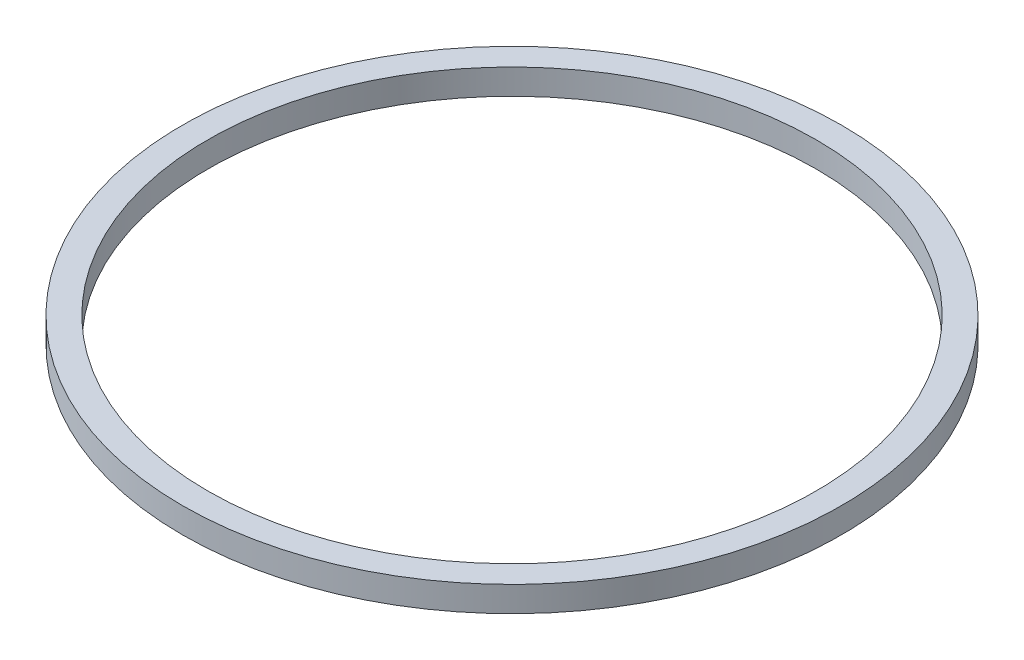
ISO-10303-21;
HEADER;
FILE_DESCRIPTION(('STEP AP214'),'2;1');
FILE_NAME('part.step','',(''),(''),'','','');
FILE_SCHEMA(('AUTOMOTIVE_DESIGN { 1 0 10303 214 1 1 1 1 }'));
ENDSEC;
DATA;
#1=APPLICATION_CONTEXT('core data for automotive mechanical design processes');
#2=APPLICATION_PROTOCOL_DEFINITION('international standard','automotive_design',2000,#1);
#3=PRODUCT_CONTEXT('',#1,'mechanical');
#4=PRODUCT('Part','Part','',(#3));
#5=PRODUCT_RELATED_PRODUCT_CATEGORY('part','',(#4));
#6=PRODUCT_DEFINITION_FORMATION('','',#4);
#7=PRODUCT_DEFINITION_CONTEXT('part definition',#1,'design');
#8=PRODUCT_DEFINITION('design','',#6,#7);
#9=PRODUCT_DEFINITION_SHAPE('','',#8);
#10=(LENGTH_UNIT() NAMED_UNIT(*) SI_UNIT(.MILLI.,.METRE.));
#11=(NAMED_UNIT(*) PLANE_ANGLE_UNIT() SI_UNIT($,.RADIAN.));
#12=(NAMED_UNIT(*) SI_UNIT($,.STERADIAN.) SOLID_ANGLE_UNIT());
#13=UNCERTAINTY_MEASURE_WITH_UNIT(LENGTH_MEASURE(1.E-05),#10,'distance_accuracy_value','');
#14=(GEOMETRIC_REPRESENTATION_CONTEXT(3) GLOBAL_UNCERTAINTY_ASSIGNED_CONTEXT((#13)) GLOBAL_UNIT_ASSIGNED_CONTEXT((#10,
#11,#12)) REPRESENTATION_CONTEXT('',''));
#15=CARTESIAN_POINT('',(0.,0.,0.));
#16=DIRECTION('',(0.,0.,1.));
#17=DIRECTION('',(1.,0.,0.));
#18=AXIS2_PLACEMENT_3D('',#15,#16,#17);
#19=CARTESIAN_POINT('',(0.,1.,0.));
#20=DIRECTION('',(0.,1.,0.));
#21=DIRECTION('',(0.,0.,1.));
#22=AXIS2_PLACEMENT_3D('',#19,#20,#21);
#23=PLANE('',#22);
#24=CARTESIAN_POINT('',(0.,1.,0.));
#25=DIRECTION('',(0.,1.,0.));
#26=DIRECTION('',(0.,0.,1.));
#27=AXIS2_PLACEMENT_3D('',#24,#25,#26);
#28=CIRCLE('',#27,13.);
#29=CARTESIAN_POINT('',(0.,1.,13.));
#30=VERTEX_POINT('',#29);
#31=EDGE_CURVE('E10',#30,#30,#28,.T.);
#32=ORIENTED_EDGE('',*,*,#31,.T.);
#33=EDGE_LOOP('',(#32));
#34=FACE_BOUND('',#33,.T.);
#35=CARTESIAN_POINT('',(0.,1.,0.));
#36=DIRECTION('',(0.,1.,0.));
#37=DIRECTION('',(0.,0.,1.));
#38=AXIS2_PLACEMENT_3D('',#35,#36,#37);
#39=CIRCLE('',#38,12.);
#40=CARTESIAN_POINT('',(0.,1.,12.));
#41=VERTEX_POINT('',#40);
#42=EDGE_CURVE('E56',#41,#41,#39,.T.);
#43=ORIENTED_EDGE('',*,*,#42,.F.);
#44=EDGE_LOOP('',(#43));
#45=FACE_BOUND('',#44,.T.);
#46=ADVANCED_FACE('F43',(#34,#45),#23,.T.);
#47=CARTESIAN_POINT('',(0.,0.,0.));
#48=DIRECTION('',(0.,1.,0.));
#49=DIRECTION('',(0.,0.,1.));
#50=AXIS2_PLACEMENT_3D('',#47,#48,#49);
#51=PLANE('',#50);
#52=CARTESIAN_POINT('',(0.,0.,0.));
#53=DIRECTION('',(0.,1.,0.));
#54=DIRECTION('',(0.,0.,1.));
#55=AXIS2_PLACEMENT_3D('',#52,#53,#54);
#56=CIRCLE('',#55,13.);
#57=CARTESIAN_POINT('',(0.,0.,13.));
#58=VERTEX_POINT('',#57);
#59=EDGE_CURVE('E47',#58,#58,#56,.T.);
#60=ORIENTED_EDGE('',*,*,#59,.F.);
#61=EDGE_LOOP('',(#60));
#62=FACE_BOUND('',#61,.T.);
#63=CARTESIAN_POINT('',(0.,0.,0.));
#64=DIRECTION('',(0.,1.,0.));
#65=DIRECTION('',(0.,0.,1.));
#66=AXIS2_PLACEMENT_3D('',#63,#64,#65);
#67=CIRCLE('',#66,12.);
#68=CARTESIAN_POINT('',(0.,0.,12.));
#69=VERTEX_POINT('',#68);
#70=EDGE_CURVE('E58',#69,#69,#67,.T.);
#71=ORIENTED_EDGE('',*,*,#70,.T.);
#72=EDGE_LOOP('',(#71));
#73=FACE_BOUND('',#72,.T.);
#74=ADVANCED_FACE('F70',(#62,#73),#51,.F.);
#75=CARTESIAN_POINT('',(0.,1.,0.));
#76=DIRECTION('',(0.,-1.,0.));
#77=DIRECTION('',(0.,0.,-1.));
#78=AXIS2_PLACEMENT_3D('',#75,#76,#77);
#79=CYLINDRICAL_SURFACE('',#78,13.);
#80=ORIENTED_EDGE('',*,*,#31,.F.);
#81=EDGE_LOOP('',(#80));
#82=FACE_BOUND('',#81,.T.);
#83=ORIENTED_EDGE('',*,*,#59,.T.);
#84=EDGE_LOOP('',(#83));
#85=FACE_BOUND('',#84,.T.);
#86=ADVANCED_FACE('F45',(#82,#85),#79,.T.);
#87=CARTESIAN_POINT('',(0.,1.,0.));
#88=DIRECTION('',(0.,-1.,0.));
#89=DIRECTION('',(0.,0.,-1.));
#90=AXIS2_PLACEMENT_3D('',#87,#88,#89);
#91=CYLINDRICAL_SURFACE('',#90,12.);
#92=ORIENTED_EDGE('',*,*,#42,.T.);
#93=EDGE_LOOP('',(#92));
#94=FACE_BOUND('',#93,.T.);
#95=ORIENTED_EDGE('',*,*,#70,.F.);
#96=EDGE_LOOP('',(#95));
#97=FACE_BOUND('',#96,.T.);
#98=ADVANCED_FACE('F66',(#94,#97),#91,.F.);
#99=CLOSED_SHELL('',(#46,#74,#86,#98));
#100=MANIFOLD_SOLID_BREP('B2',#99);
#101=ADVANCED_BREP_SHAPE_REPRESENTATION('',(#18,#100),#14);
#102=SHAPE_DEFINITION_REPRESENTATION(#9,#101);
ENDSEC;
END-ISO-10303-21;
